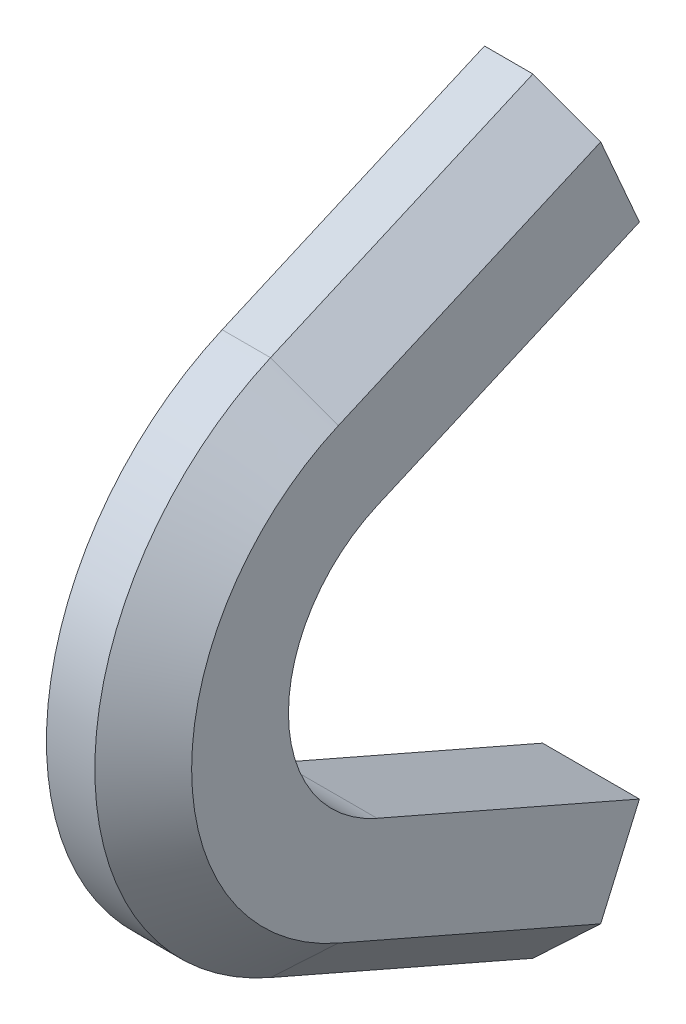
ISO-10303-21;
HEADER;
FILE_DESCRIPTION(('STEP AP214'),'2;1');
FILE_NAME('part.step','',(''),(''),'','','');
FILE_SCHEMA(('AUTOMOTIVE_DESIGN { 1 0 10303 214 1 1 1 1 }'));
ENDSEC;
DATA;
#1=APPLICATION_CONTEXT('core data for automotive mechanical design processes');
#2=APPLICATION_PROTOCOL_DEFINITION('international standard','automotive_design',2000,#1);
#3=PRODUCT_CONTEXT('',#1,'mechanical');
#4=PRODUCT('Part','Part','',(#3));
#5=PRODUCT_RELATED_PRODUCT_CATEGORY('part','',(#4));
#6=PRODUCT_DEFINITION_FORMATION('','',#4);
#7=PRODUCT_DEFINITION_CONTEXT('part definition',#1,'design');
#8=PRODUCT_DEFINITION('design','',#6,#7);
#9=PRODUCT_DEFINITION_SHAPE('','',#8);
#10=(LENGTH_UNIT() NAMED_UNIT(*) SI_UNIT(.MILLI.,.METRE.));
#11=(NAMED_UNIT(*) PLANE_ANGLE_UNIT() SI_UNIT($,.RADIAN.));
#12=(NAMED_UNIT(*) SI_UNIT($,.STERADIAN.) SOLID_ANGLE_UNIT());
#13=UNCERTAINTY_MEASURE_WITH_UNIT(LENGTH_MEASURE(1.E-05),#10,'distance_accuracy_value','');
#14=(GEOMETRIC_REPRESENTATION_CONTEXT(3) GLOBAL_UNCERTAINTY_ASSIGNED_CONTEXT((#13)) GLOBAL_UNIT_ASSIGNED_CONTEXT((#10,
#11,#12)) REPRESENTATION_CONTEXT('',''));
#15=CARTESIAN_POINT('',(0.,0.,0.));
#16=DIRECTION('',(0.,0.,1.));
#17=DIRECTION('',(1.,0.,0.));
#18=AXIS2_PLACEMENT_3D('',#15,#16,#17);
#19=CARTESIAN_POINT('',(-10.,-25.8052911990937,-21.0000000000003));
#20=DIRECTION('',(0.,0.400029137237274,0.916502421906916));
#21=DIRECTION('',(0.,-0.916502421906916,0.400029137237274));
#22=AXIS2_PLACEMENT_3D('',#19,#20,#21);
#23=PLANE('',#22);
#24=DIRECTION('',(0.,-0.916502421906916,0.400029137237274));
#25=VECTOR('',#24,1.);
#26=CARTESIAN_POINT('',(0.,-25.8052911990942,-21.0000000000003));
#27=LINE('',#26,#25);
#28=CARTESIAN_POINT('',(0.,-25.8052911990942,-21.0000000000003));
#29=VERTEX_POINT('',#28);
#30=CARTESIAN_POINT('',(2.22044604925031E-13,-34.9703154181633,-16.9997086276274));
#31=VERTEX_POINT('',#30);
#32=EDGE_CURVE('E186',#29,#31,#27,.T.);
#33=ORIENTED_EDGE('',*,*,#32,.T.);
#34=DIRECTION('',(0.707106781186547,0.648065077504264,-0.282863315612673));
#35=VECTOR('',#34,1.);
#36=CARTESIAN_POINT('',(-5.00000000000078,-39.5528275276978,-14.999562941441));
#37=LINE('',#36,#35);
#38=CARTESIAN_POINT('',(-5.00000000000078,-39.5528275276978,-14.999562941441));
#39=VERTEX_POINT('',#38);
#40=EDGE_CURVE('E165',#31,#39,#37,.F.);
#41=ORIENTED_EDGE('',*,*,#40,.T.);
#42=DIRECTION('',(1.,0.,0.));
#43=VECTOR('',#42,1.);
#44=CARTESIAN_POINT('',(-10.0000000000007,-39.5528275276973,-14.999562941441));
#45=LINE('',#44,#43);
#46=CARTESIAN_POINT('',(-10.0000000000007,-39.5528275276973,-14.999562941441));
#47=VERTEX_POINT('',#46);
#48=EDGE_CURVE('E146',#47,#39,#45,.T.);
#49=ORIENTED_EDGE('',*,*,#48,.F.);
#50=DIRECTION('',(0.,-0.916502421906916,0.400029137237274));
#51=VECTOR('',#50,1.);
#52=CARTESIAN_POINT('',(-10.,-25.8052911990937,-21.0000000000003));
#53=LINE('',#52,#51);
#54=CARTESIAN_POINT('',(-10.,-25.8052911990937,-21.0000000000003));
#55=VERTEX_POINT('',#54);
#56=EDGE_CURVE('E152',#55,#47,#53,.T.);
#57=ORIENTED_EDGE('',*,*,#56,.F.);
#58=DIRECTION('',(1.,0.,0.));
#59=VECTOR('',#58,1.);
#60=CARTESIAN_POINT('',(-10.,-25.8052911990937,-21.0000000000003));
#61=LINE('',#60,#59);
#62=EDGE_CURVE('E202',#55,#29,#61,.T.);
#63=ORIENTED_EDGE('',*,*,#62,.T.);
#64=EDGE_LOOP('',(#33,#41,#49,#57,#63));
#65=FACE_BOUND('',#64,.T.);
#66=ADVANCED_FACE('F61',(#65),#23,.F.);
#67=CARTESIAN_POINT('',(-10.,-27.7241982626833,12.1008814014276));
#68=DIRECTION('',(0.,0.916502421906916,-0.400029137237274));
#69=DIRECTION('',(0.,0.400029137237274,0.916502421906916));
#70=AXIS2_PLACEMENT_3D('',#67,#68,#69);
#71=PLANE('',#70);
#72=ORIENTED_EDGE('',*,*,#48,.T.);
#73=DIRECTION('',(0.,0.400029137237274,0.916502421906916));
#74=VECTOR('',#73,1.);
#75=CARTESIAN_POINT('',(-4.99999999999989,-27.7241982626837,12.1008814014276));
#76=LINE('',#75,#74);
#77=CARTESIAN_POINT('',(-4.99999999999989,-27.7241982626837,12.1008814014276));
#78=VERTEX_POINT('',#77);
#79=EDGE_CURVE('E166',#39,#78,#76,.T.);
#80=ORIENTED_EDGE('',*,*,#79,.T.);
#81=DIRECTION('',(1.,0.,0.));
#82=VECTOR('',#81,1.);
#83=CARTESIAN_POINT('',(-10.,-27.7241982626833,12.1008814014276));
#84=LINE('',#83,#82);
#85=CARTESIAN_POINT('',(-10.,-27.7241982626833,12.1008814014276));
#86=VERTEX_POINT('',#85);
#87=EDGE_CURVE('E148',#86,#78,#84,.T.);
#88=ORIENTED_EDGE('',*,*,#87,.F.);
#89=DIRECTION('',(0.,0.400029137237274,0.916502421906916));
#90=VECTOR('',#89,1.);
#91=CARTESIAN_POINT('',(-10.,-27.7241982626833,12.1008814014276));
#92=LINE('',#91,#90);
#93=EDGE_CURVE('E141',#47,#86,#92,.T.);
#94=ORIENTED_EDGE('',*,*,#93,.F.);
#95=EDGE_LOOP('',(#72,#80,#88,#94));
#96=FACE_BOUND('',#95,.T.);
#97=ADVANCED_FACE('F143',(#96),#71,.F.);
#98=CARTESIAN_POINT('',(-10.,4.44089209850063E-13,0.));
#99=DIRECTION('',(1.,0.,0.));
#100=DIRECTION('',(0.,0.,-1.));
#101=AXIS2_PLACEMENT_3D('',#98,#99,#100);
#102=CYLINDRICAL_SURFACE('',#101,30.25);
#103=ORIENTED_EDGE('',*,*,#87,.T.);
#104=CARTESIAN_POINT('',(-5.00000000000012,0.,0.));
#105=DIRECTION('',(-1.,0.,0.));
#106=DIRECTION('',(0.,0.,1.));
#107=AXIS2_PLACEMENT_3D('',#104,#105,#106);
#108=CIRCLE('',#107,30.25);
#109=CARTESIAN_POINT('',(-5.,27.7241982626837,12.1008814014276));
#110=VERTEX_POINT('',#109);
#111=EDGE_CURVE('E12',#78,#110,#108,.T.);
#112=ORIENTED_EDGE('',*,*,#111,.T.);
#113=DIRECTION('',(1.,0.,0.));
#114=VECTOR('',#113,1.);
#115=CARTESIAN_POINT('',(-9.9999999999999,27.7241982626842,12.1008814014276));
#116=LINE('',#115,#114);
#117=CARTESIAN_POINT('',(-9.9999999999999,27.7241982626842,12.1008814014276));
#118=VERTEX_POINT('',#117);
#119=EDGE_CURVE('E170',#118,#110,#116,.T.);
#120=ORIENTED_EDGE('',*,*,#119,.F.);
#121=CARTESIAN_POINT('',(-10.,4.44089209850063E-13,0.));
#122=DIRECTION('',(-1.,0.,0.));
#123=DIRECTION('',(0.,0.,1.));
#124=AXIS2_PLACEMENT_3D('',#121,#122,#123);
#125=CIRCLE('',#124,30.25);
#126=EDGE_CURVE('E151',#86,#118,#125,.T.);
#127=ORIENTED_EDGE('',*,*,#126,.F.);
#128=EDGE_LOOP('',(#103,#112,#120,#127));
#129=FACE_BOUND('',#128,.T.);
#130=ADVANCED_FACE('F245',(#129),#102,.T.);
#131=CARTESIAN_POINT('',(-9.9999999999999,27.7241982626842,12.1008814014276));
#132=DIRECTION('',(0.,-0.916502421906916,-0.400029137237274));
#133=DIRECTION('',(0.,0.400029137237274,-0.916502421906916));
#134=AXIS2_PLACEMENT_3D('',#131,#132,#133);
#135=PLANE('',#134);
#136=ORIENTED_EDGE('',*,*,#119,.T.);
#137=DIRECTION('',(0.,0.400029137237274,-0.916502421906916));
#138=VECTOR('',#137,1.);
#139=CARTESIAN_POINT('',(-5.,27.7241982626837,12.1008814014276));
#140=LINE('',#139,#138);
#141=CARTESIAN_POINT('',(-4.99999999999989,39.5528275276978,-14.999562941441));
#142=VERTEX_POINT('',#141);
#143=EDGE_CURVE('E83',#110,#142,#140,.T.);
#144=ORIENTED_EDGE('',*,*,#143,.T.);
#145=DIRECTION('',(1.,0.,0.));
#146=VECTOR('',#145,1.);
#147=CARTESIAN_POINT('',(-10.,39.5528275276982,-14.999562941441));
#148=LINE('',#147,#146);
#149=CARTESIAN_POINT('',(-10.,39.5528275276982,-14.999562941441));
#150=VERTEX_POINT('',#149);
#151=EDGE_CURVE('E213',#150,#142,#148,.T.);
#152=ORIENTED_EDGE('',*,*,#151,.F.);
#153=DIRECTION('',(0.,0.400029137237274,-0.916502421906916));
#154=VECTOR('',#153,1.);
#155=CARTESIAN_POINT('',(-9.9999999999999,27.7241982626842,12.1008814014276));
#156=LINE('',#155,#154);
#157=EDGE_CURVE('E216',#118,#150,#156,.T.);
#158=ORIENTED_EDGE('',*,*,#157,.F.);
#159=EDGE_LOOP('',(#136,#144,#152,#158));
#160=FACE_BOUND('',#159,.T.);
#161=ADVANCED_FACE('F215',(#160),#135,.F.);
#162=CARTESIAN_POINT('',(-10.,39.5528275276982,-14.999562941441));
#163=DIRECTION('',(0.,-0.400029137237274,0.916502421906916));
#164=DIRECTION('',(0.,-0.916502421906916,-0.400029137237274));
#165=AXIS2_PLACEMENT_3D('',#162,#163,#164);
#166=PLANE('',#165);
#167=ORIENTED_EDGE('',*,*,#151,.T.);
#168=DIRECTION('',(-0.707106781186547,0.648065077504266,0.282863315612676));
#169=VECTOR('',#168,1.);
#170=CARTESIAN_POINT('',(-4.99999999999989,39.5528275276978,-14.999562941441));
#171=LINE('',#170,#169);
#172=CARTESIAN_POINT('',(0.,34.9703154181633,-16.999708627627));
#173=VERTEX_POINT('',#172);
#174=EDGE_CURVE('E70',#142,#173,#171,.F.);
#175=ORIENTED_EDGE('',*,*,#174,.T.);
#176=DIRECTION('',(0.,-0.916502421906916,-0.400029137237274));
#177=VECTOR('',#176,1.);
#178=CARTESIAN_POINT('',(0.,39.5528275276979,-14.999562941441));
#179=LINE('',#178,#177);
#180=CARTESIAN_POINT('',(1.11022302462516E-13,25.8052911990944,-20.9999999999999));
#181=VERTEX_POINT('',#180);
#182=EDGE_CURVE('E190',#173,#181,#179,.T.);
#183=ORIENTED_EDGE('',*,*,#182,.T.);
#184=DIRECTION('',(1.,0.,0.));
#185=VECTOR('',#184,1.);
#186=CARTESIAN_POINT('',(-9.9999999999999,25.8052911990947,-20.9999999999999));
#187=LINE('',#186,#185);
#188=CARTESIAN_POINT('',(-9.9999999999999,25.8052911990947,-20.9999999999999));
#189=VERTEX_POINT('',#188);
#190=EDGE_CURVE('E210',#189,#181,#187,.T.);
#191=ORIENTED_EDGE('',*,*,#190,.F.);
#192=DIRECTION('',(0.,-0.916502421906916,-0.400029137237274));
#193=VECTOR('',#192,1.);
#194=CARTESIAN_POINT('',(-10.,39.5528275276982,-14.999562941441));
#195=LINE('',#194,#193);
#196=EDGE_CURVE('E240',#150,#189,#195,.T.);
#197=ORIENTED_EDGE('',*,*,#196,.F.);
#198=EDGE_LOOP('',(#167,#175,#183,#191,#197));
#199=FACE_BOUND('',#198,.T.);
#200=ADVANCED_FACE('F222',(#199),#166,.F.);
#201=CARTESIAN_POINT('',(-10.,13.9766619340806,6.10044434286827));
#202=DIRECTION('',(0.,0.916502421906916,0.400029137237274));
#203=DIRECTION('',(0.,-0.400029137237274,0.916502421906916));
#204=AXIS2_PLACEMENT_3D('',#201,#202,#203);
#205=PLANE('',#204);
#206=DIRECTION('',(0.,-0.400029137237274,0.916502421906916));
#207=VECTOR('',#206,1.);
#208=CARTESIAN_POINT('',(-1.11022302462516E-13,13.9766619340802,6.10044434286827));
#209=LINE('',#208,#207);
#210=CARTESIAN_POINT('',(-1.11022302462516E-13,13.9766619340802,6.10044434286827));
#211=VERTEX_POINT('',#210);
#212=EDGE_CURVE('E193',#181,#211,#209,.T.);
#213=ORIENTED_EDGE('',*,*,#212,.T.);
#214=DIRECTION('',(1.,0.,0.));
#215=VECTOR('',#214,1.);
#216=CARTESIAN_POINT('',(-10.,13.9766619340806,6.10044434286827));
#217=LINE('',#216,#215);
#218=CARTESIAN_POINT('',(-10.,13.9766619340806,6.10044434286827));
#219=VERTEX_POINT('',#218);
#220=EDGE_CURVE('E207',#219,#211,#217,.T.);
#221=ORIENTED_EDGE('',*,*,#220,.F.);
#222=DIRECTION('',(0.,-0.400029137237274,0.916502421906916));
#223=VECTOR('',#222,1.);
#224=CARTESIAN_POINT('',(-10.,13.9766619340806,6.10044434286827));
#225=LINE('',#224,#223);
#226=EDGE_CURVE('E239',#189,#219,#225,.T.);
#227=ORIENTED_EDGE('',*,*,#226,.F.);
#228=ORIENTED_EDGE('',*,*,#190,.T.);
#229=EDGE_LOOP('',(#213,#221,#227,#228));
#230=FACE_BOUND('',#229,.T.);
#231=ADVANCED_FACE('F232',(#230),#205,.F.);
#232=CARTESIAN_POINT('',(-10.,4.44089209850063E-13,0.));
#233=DIRECTION('',(1.,0.,0.));
#234=DIRECTION('',(0.,0.,-1.));
#235=AXIS2_PLACEMENT_3D('',#232,#233,#234);
#236=CYLINDRICAL_SURFACE('',#235,15.25);
#237=CARTESIAN_POINT('',(0.,0.,0.));
#238=DIRECTION('',(1.,0.,0.));
#239=DIRECTION('',(0.,0.,1.));
#240=AXIS2_PLACEMENT_3D('',#237,#238,#239);
#241=CIRCLE('',#240,15.25);
#242=CARTESIAN_POINT('',(0.,-13.9766619340803,6.10044434286827));
#243=VERTEX_POINT('',#242);
#244=EDGE_CURVE('E199',#211,#243,#241,.T.);
#245=ORIENTED_EDGE('',*,*,#244,.T.);
#246=DIRECTION('',(1.,0.,0.));
#247=VECTOR('',#246,1.);
#248=CARTESIAN_POINT('',(-10.,-13.9766619340798,6.10044434286827));
#249=LINE('',#248,#247);
#250=CARTESIAN_POINT('',(-10.,-13.9766619340798,6.10044434286827));
#251=VERTEX_POINT('',#250);
#252=EDGE_CURVE('E204',#251,#243,#249,.T.);
#253=ORIENTED_EDGE('',*,*,#252,.F.);
#254=CARTESIAN_POINT('',(-10.,4.44089209850063E-13,0.));
#255=DIRECTION('',(1.,0.,0.));
#256=DIRECTION('',(0.,0.,1.));
#257=AXIS2_PLACEMENT_3D('',#254,#255,#256);
#258=CIRCLE('',#257,15.25);
#259=EDGE_CURVE('E238',#219,#251,#258,.T.);
#260=ORIENTED_EDGE('',*,*,#259,.F.);
#261=ORIENTED_EDGE('',*,*,#220,.T.);
#262=EDGE_LOOP('',(#245,#253,#260,#261));
#263=FACE_BOUND('',#262,.T.);
#264=ADVANCED_FACE('F236',(#263),#236,.F.);
#265=CARTESIAN_POINT('',(-10.,-13.9766619340798,6.10044434286827));
#266=DIRECTION('',(0.,-0.916502421906916,0.400029137237274));
#267=DIRECTION('',(0.,-0.400029137237274,-0.916502421906916));
#268=AXIS2_PLACEMENT_3D('',#265,#266,#267);
#269=PLANE('',#268);
#270=DIRECTION('',(0.,-0.400029137237274,-0.916502421906916));
#271=VECTOR('',#270,1.);
#272=CARTESIAN_POINT('',(0.,-13.9766619340803,6.10044434286827));
#273=LINE('',#272,#271);
#274=EDGE_CURVE('E161',#243,#29,#273,.T.);
#275=ORIENTED_EDGE('',*,*,#274,.T.);
#276=ORIENTED_EDGE('',*,*,#62,.F.);
#277=DIRECTION('',(0.,-0.400029137237274,-0.916502421906916));
#278=VECTOR('',#277,1.);
#279=CARTESIAN_POINT('',(-10.,-13.9766619340798,6.10044434286827));
#280=LINE('',#279,#278);
#281=EDGE_CURVE('E157',#251,#55,#280,.T.);
#282=ORIENTED_EDGE('',*,*,#281,.F.);
#283=ORIENTED_EDGE('',*,*,#252,.T.);
#284=EDGE_LOOP('',(#275,#276,#282,#283));
#285=FACE_BOUND('',#284,.T.);
#286=ADVANCED_FACE('F273',(#285),#269,.F.);
#287=CARTESIAN_POINT('',(-10.,4.44089209850063E-13,0.));
#288=DIRECTION('',(-1.,0.,0.));
#289=DIRECTION('',(0.,0.,1.));
#290=AXIS2_PLACEMENT_3D('',#287,#288,#289);
#291=PLANE('',#290);
#292=ORIENTED_EDGE('',*,*,#56,.T.);
#293=ORIENTED_EDGE('',*,*,#93,.T.);
#294=ORIENTED_EDGE('',*,*,#126,.T.);
#295=ORIENTED_EDGE('',*,*,#157,.T.);
#296=ORIENTED_EDGE('',*,*,#196,.T.);
#297=ORIENTED_EDGE('',*,*,#226,.T.);
#298=ORIENTED_EDGE('',*,*,#259,.T.);
#299=ORIENTED_EDGE('',*,*,#281,.T.);
#300=EDGE_LOOP('',(#292,#293,#294,#295,#296,#297,#298,#299));
#301=FACE_BOUND('',#300,.T.);
#302=ADVANCED_FACE('F155',(#301),#291,.T.);
#303=CARTESIAN_POINT('',(0.,0.,0.));
#304=DIRECTION('',(-1.,0.,0.));
#305=DIRECTION('',(0.,0.,1.));
#306=AXIS2_PLACEMENT_3D('',#303,#304,#305);
#307=PLANE('',#306);
#308=CARTESIAN_POINT('',(0.,0.,0.));
#309=DIRECTION('',(-1.,0.,0.));
#310=DIRECTION('',(0.,0.,1.));
#311=AXIS2_PLACEMENT_3D('',#308,#309,#310);
#312=CIRCLE('',#311,25.25);
#313=CARTESIAN_POINT('',(0.,23.1416861531489,10.1007357152412));
#314=VERTEX_POINT('',#313);
#315=CARTESIAN_POINT('',(0.,-23.1416861531492,10.1007357152412));
#316=VERTEX_POINT('',#315);
#317=EDGE_CURVE('E168',#314,#316,#312,.F.);
#318=ORIENTED_EDGE('',*,*,#317,.T.);
#319=DIRECTION('',(0.,-0.400029137237274,-0.916502421906916));
#320=VECTOR('',#319,1.);
#321=CARTESIAN_POINT('',(0.,-23.1416861531492,10.1007357152412));
#322=LINE('',#321,#320);
#323=EDGE_CURVE('E177',#316,#31,#322,.T.);
#324=ORIENTED_EDGE('',*,*,#323,.T.);
#325=ORIENTED_EDGE('',*,*,#32,.F.);
#326=ORIENTED_EDGE('',*,*,#274,.F.);
#327=ORIENTED_EDGE('',*,*,#244,.F.);
#328=ORIENTED_EDGE('',*,*,#212,.F.);
#329=ORIENTED_EDGE('',*,*,#182,.F.);
#330=DIRECTION('',(0.,-0.400029137237274,0.916502421906916));
#331=VECTOR('',#330,1.);
#332=CARTESIAN_POINT('',(0.,23.1416861531489,10.1007357152412));
#333=LINE('',#332,#331);
#334=EDGE_CURVE('E175',#173,#314,#333,.T.);
#335=ORIENTED_EDGE('',*,*,#334,.T.);
#336=EDGE_LOOP('',(#318,#324,#325,#326,#327,#328,#329,#335));
#337=FACE_BOUND('',#336,.T.);
#338=ADVANCED_FACE('F227',(#337),#307,.F.);
#339=CARTESIAN_POINT('',(-5.,27.7241982626837,12.1008814014276));
#340=DIRECTION('',(-0.707106781186549,-0.648065077504263,-0.282863315612678));
#341=DIRECTION('',(0.,0.400029137237274,-0.916502421906916));
#342=AXIS2_PLACEMENT_3D('',#339,#340,#341);
#343=PLANE('',#342);
#344=ORIENTED_EDGE('',*,*,#174,.F.);
#345=ORIENTED_EDGE('',*,*,#143,.F.);
#346=DIRECTION('',(-0.707106781186547,0.648065077504265,0.282863315612676));
#347=VECTOR('',#346,1.);
#348=CARTESIAN_POINT('',(0.,23.1416861531489,10.1007357152412));
#349=LINE('',#348,#347);
#350=EDGE_CURVE('E65',#314,#110,#349,.T.);
#351=ORIENTED_EDGE('',*,*,#350,.F.);
#352=ORIENTED_EDGE('',*,*,#334,.F.);
#353=EDGE_LOOP('',(#344,#345,#351,#352));
#354=FACE_BOUND('',#353,.T.);
#355=ADVANCED_FACE('F63',(#354),#343,.F.);
#356=CARTESIAN_POINT('',(-5.00000000000012,0.,0.));
#357=DIRECTION('',(-1.,0.,0.));
#358=DIRECTION('',(0.,0.,1.));
#359=AXIS2_PLACEMENT_3D('',#356,#357,#358);
#360=CONICAL_SURFACE('',#359,30.25,0.78539816339745);
#361=ORIENTED_EDGE('',*,*,#350,.T.);
#362=ORIENTED_EDGE('',*,*,#111,.F.);
#363=DIRECTION('',(-0.707106781186546,-0.648065077504264,0.282863315612673));
#364=VECTOR('',#363,1.);
#365=CARTESIAN_POINT('',(0.,-23.1416861531492,10.1007357152412));
#366=LINE('',#365,#364);
#367=EDGE_CURVE('E181',#316,#78,#366,.T.);
#368=ORIENTED_EDGE('',*,*,#367,.F.);
#369=ORIENTED_EDGE('',*,*,#317,.F.);
#370=EDGE_LOOP('',(#361,#362,#368,#369));
#371=FACE_BOUND('',#370,.T.);
#372=ADVANCED_FACE('F261',(#371),#360,.T.);
#373=CARTESIAN_POINT('',(-4.99999999999989,-27.7241982626837,12.1008814014276));
#374=DIRECTION('',(-0.707106781186548,0.648065077504263,-0.282863315612675));
#375=DIRECTION('',(0.,0.400029137237274,0.916502421906916));
#376=AXIS2_PLACEMENT_3D('',#373,#374,#375);
#377=PLANE('',#376);
#378=ORIENTED_EDGE('',*,*,#40,.F.);
#379=ORIENTED_EDGE('',*,*,#323,.F.);
#380=ORIENTED_EDGE('',*,*,#367,.T.);
#381=ORIENTED_EDGE('',*,*,#79,.F.);
#382=EDGE_LOOP('',(#378,#379,#380,#381));
#383=FACE_BOUND('',#382,.T.);
#384=ADVANCED_FACE('F259',(#383),#377,.F.);
#385=CLOSED_SHELL('',(#66,#97,#130,#161,#200,#231,#264,#286,#302,#338,#355,#372,#384));
#386=MANIFOLD_SOLID_BREP('B2',#385);
#387=ADVANCED_BREP_SHAPE_REPRESENTATION('',(#18,#386),#14);
#388=SHAPE_DEFINITION_REPRESENTATION(#9,#387);
ENDSEC;
END-ISO-10303-21;
